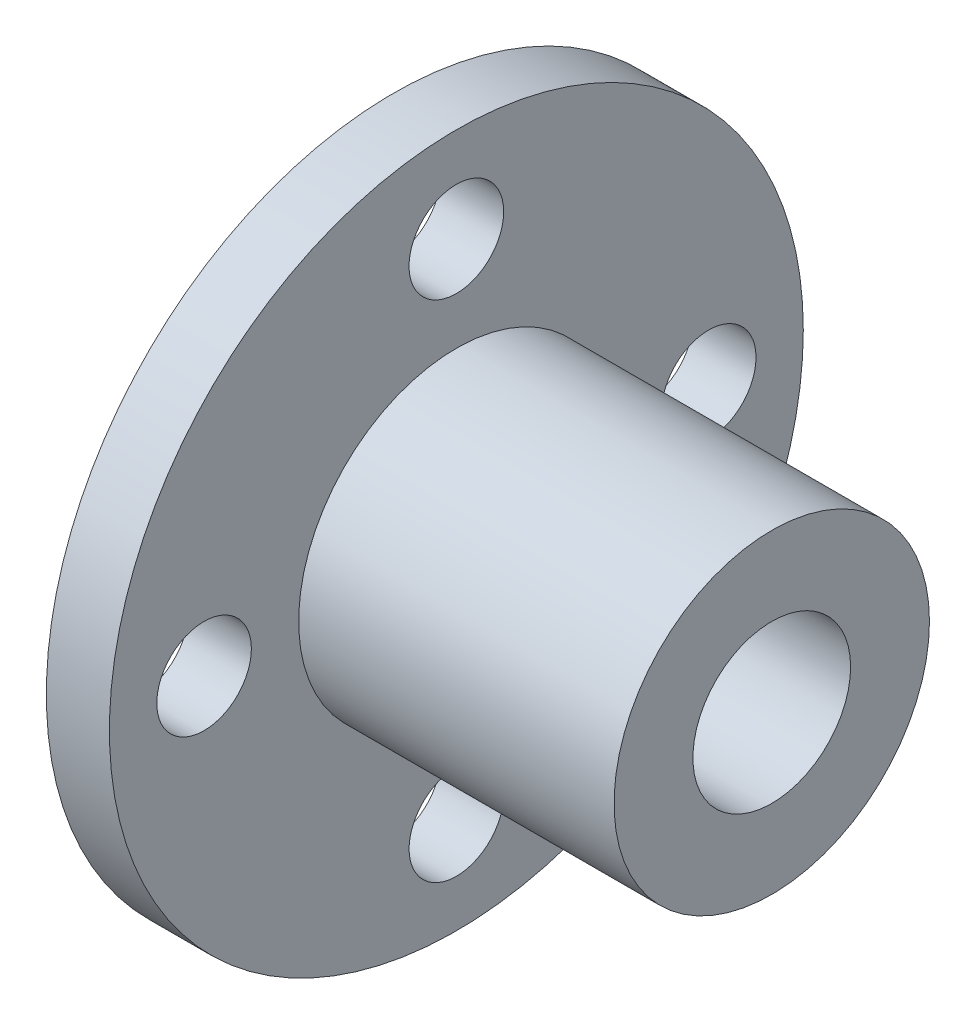
ISO-10303-21;
HEADER;
FILE_DESCRIPTION(('STEP AP214'),'2;1');
FILE_NAME('part.step','',(''),(''),'','','');
FILE_SCHEMA(('AUTOMOTIVE_DESIGN { 1 0 10303 214 1 1 1 1 }'));
ENDSEC;
DATA;
#1=APPLICATION_CONTEXT('core data for automotive mechanical design processes');
#2=APPLICATION_PROTOCOL_DEFINITION('international standard','automotive_design',2000,#1);
#3=PRODUCT_CONTEXT('',#1,'mechanical');
#4=PRODUCT('Part','Part','',(#3));
#5=PRODUCT_RELATED_PRODUCT_CATEGORY('part','',(#4));
#6=PRODUCT_DEFINITION_FORMATION('','',#4);
#7=PRODUCT_DEFINITION_CONTEXT('part definition',#1,'design');
#8=PRODUCT_DEFINITION('design','',#6,#7);
#9=PRODUCT_DEFINITION_SHAPE('','',#8);
#10=(LENGTH_UNIT() NAMED_UNIT(*) SI_UNIT(.MILLI.,.METRE.));
#11=(NAMED_UNIT(*) PLANE_ANGLE_UNIT() SI_UNIT($,.RADIAN.));
#12=(NAMED_UNIT(*) SI_UNIT($,.STERADIAN.) SOLID_ANGLE_UNIT());
#13=UNCERTAINTY_MEASURE_WITH_UNIT(LENGTH_MEASURE(1.E-05),#10,'distance_accuracy_value','');
#14=(GEOMETRIC_REPRESENTATION_CONTEXT(3) GLOBAL_UNCERTAINTY_ASSIGNED_CONTEXT((#13)) GLOBAL_UNIT_ASSIGNED_CONTEXT((#10,
#11,#12)) REPRESENTATION_CONTEXT('',''));
#15=CARTESIAN_POINT('',(0.,0.,0.));
#16=DIRECTION('',(0.,0.,1.));
#17=DIRECTION('',(1.,0.,0.));
#18=AXIS2_PLACEMENT_3D('',#15,#16,#17);
#19=CARTESIAN_POINT('',(2.,0.,0.));
#20=DIRECTION('',(-1.,0.,0.));
#21=DIRECTION('',(0.,0.,1.));
#22=AXIS2_PLACEMENT_3D('',#19,#20,#21);
#23=CYLINDRICAL_SURFACE('',#22,11.);
#24=CARTESIAN_POINT('',(2.,0.,0.));
#25=DIRECTION('',(1.,0.,0.));
#26=DIRECTION('',(0.,0.,-1.));
#27=AXIS2_PLACEMENT_3D('',#24,#25,#26);
#28=CIRCLE('',#27,11.);
#29=CARTESIAN_POINT('',(2.,0.,-11.));
#30=VERTEX_POINT('',#29);
#31=EDGE_CURVE('E10',#30,#30,#28,.T.);
#32=ORIENTED_EDGE('',*,*,#31,.F.);
#33=EDGE_LOOP('',(#32));
#34=FACE_BOUND('',#33,.T.);
#35=CARTESIAN_POINT('',(0.,0.,0.));
#36=DIRECTION('',(1.,0.,0.));
#37=DIRECTION('',(0.,0.,-1.));
#38=AXIS2_PLACEMENT_3D('',#35,#36,#37);
#39=CIRCLE('',#38,11.);
#40=CARTESIAN_POINT('',(0.,0.,-11.));
#41=VERTEX_POINT('',#40);
#42=EDGE_CURVE('E46',#41,#41,#39,.T.);
#43=ORIENTED_EDGE('',*,*,#42,.T.);
#44=EDGE_LOOP('',(#43));
#45=FACE_BOUND('',#44,.T.);
#46=ADVANCED_FACE('F39',(#34,#45),#23,.T.);
#47=CARTESIAN_POINT('',(2.,0.,0.));
#48=DIRECTION('',(1.,0.,0.));
#49=DIRECTION('',(0.,0.,-1.));
#50=AXIS2_PLACEMENT_3D('',#47,#48,#49);
#51=PLANE('',#50);
#52=CARTESIAN_POINT('',(2.,8.,0.));
#53=DIRECTION('',(1.,0.,0.));
#54=DIRECTION('',(0.,0.,-1.));
#55=AXIS2_PLACEMENT_3D('',#52,#53,#54);
#56=CIRCLE('',#55,1.5);
#57=CARTESIAN_POINT('',(2.,8.,-1.5));
#58=VERTEX_POINT('',#57);
#59=EDGE_CURVE('E61',#58,#58,#56,.T.);
#60=ORIENTED_EDGE('',*,*,#59,.F.);
#61=EDGE_LOOP('',(#60));
#62=FACE_BOUND('',#61,.T.);
#63=CARTESIAN_POINT('',(2.,0.000999999999972068,-8.001));
#64=DIRECTION('',(1.,0.,0.));
#65=DIRECTION('',(0.,0.,-1.));
#66=AXIS2_PLACEMENT_3D('',#63,#64,#65);
#67=CIRCLE('',#66,1.5);
#68=CARTESIAN_POINT('',(2.,0.000999999999972068,-9.501));
#69=VERTEX_POINT('',#68);
#70=EDGE_CURVE('E87',#69,#69,#67,.T.);
#71=ORIENTED_EDGE('',*,*,#70,.F.);
#72=EDGE_LOOP('',(#71));
#73=FACE_BOUND('',#72,.T.);
#74=CARTESIAN_POINT('',(2.,-8.,-0.00199999999994414));
#75=DIRECTION('',(1.,0.,0.));
#76=DIRECTION('',(0.,0.,-1.));
#77=AXIS2_PLACEMENT_3D('',#74,#75,#76);
#78=CIRCLE('',#77,1.5);
#79=CARTESIAN_POINT('',(2.,-8.,-1.50199999999994));
#80=VERTEX_POINT('',#79);
#81=EDGE_CURVE('E83',#80,#80,#78,.T.);
#82=ORIENTED_EDGE('',*,*,#81,.F.);
#83=EDGE_LOOP('',(#82));
#84=FACE_BOUND('',#83,.T.);
#85=CARTESIAN_POINT('',(2.,-0.000999999999916204,7.999));
#86=DIRECTION('',(1.,0.,0.));
#87=DIRECTION('',(0.,0.,-1.));
#88=AXIS2_PLACEMENT_3D('',#85,#86,#87);
#89=CIRCLE('',#88,1.5);
#90=CARTESIAN_POINT('',(2.,-0.000999999999916204,6.499));
#91=VERTEX_POINT('',#90);
#92=EDGE_CURVE('E80',#91,#91,#89,.T.);
#93=ORIENTED_EDGE('',*,*,#92,.F.);
#94=EDGE_LOOP('',(#93));
#95=FACE_BOUND('',#94,.T.);
#96=CARTESIAN_POINT('',(2.,0.,0.));
#97=DIRECTION('',(1.,0.,0.));
#98=DIRECTION('',(0.,0.,-1.));
#99=AXIS2_PLACEMENT_3D('',#96,#97,#98);
#100=CIRCLE('',#99,5.);
#101=CARTESIAN_POINT('',(2.,0.,-5.));
#102=VERTEX_POINT('',#101);
#103=EDGE_CURVE('E54',#102,#102,#100,.T.);
#104=ORIENTED_EDGE('',*,*,#103,.F.);
#105=EDGE_LOOP('',(#104));
#106=FACE_BOUND('',#105,.T.);
#107=ORIENTED_EDGE('',*,*,#31,.T.);
#108=EDGE_LOOP('',(#107));
#109=FACE_BOUND('',#108,.T.);
#110=ADVANCED_FACE('F108',(#62,#73,#84,#95,#106,#109),#51,.T.);
#111=CARTESIAN_POINT('',(0.,0.,0.));
#112=DIRECTION('',(1.,0.,0.));
#113=DIRECTION('',(0.,0.,-1.));
#114=AXIS2_PLACEMENT_3D('',#111,#112,#113);
#115=PLANE('',#114);
#116=CARTESIAN_POINT('',(0.,0.,0.));
#117=DIRECTION('',(1.,0.,0.));
#118=DIRECTION('',(0.,0.,-1.));
#119=AXIS2_PLACEMENT_3D('',#116,#117,#118);
#120=CIRCLE('',#119,2.5);
#121=CARTESIAN_POINT('',(0.,0.,-2.5));
#122=VERTEX_POINT('',#121);
#123=EDGE_CURVE('E84',#122,#122,#120,.T.);
#124=ORIENTED_EDGE('',*,*,#123,.T.);
#125=EDGE_LOOP('',(#124));
#126=FACE_BOUND('',#125,.T.);
#127=CARTESIAN_POINT('',(0.,8.,0.));
#128=DIRECTION('',(1.,0.,0.));
#129=DIRECTION('',(0.,0.,-1.));
#130=AXIS2_PLACEMENT_3D('',#127,#128,#129);
#131=CIRCLE('',#130,1.5);
#132=CARTESIAN_POINT('',(0.,8.,-1.5));
#133=VERTEX_POINT('',#132);
#134=EDGE_CURVE('E42',#133,#133,#131,.T.);
#135=ORIENTED_EDGE('',*,*,#134,.T.);
#136=EDGE_LOOP('',(#135));
#137=FACE_BOUND('',#136,.T.);
#138=CARTESIAN_POINT('',(0.,0.000999999999972068,-8.001));
#139=DIRECTION('',(1.,0.,0.));
#140=DIRECTION('',(0.,0.,-1.));
#141=AXIS2_PLACEMENT_3D('',#138,#139,#140);
#142=CIRCLE('',#141,1.5);
#143=CARTESIAN_POINT('',(0.,0.000999999999972068,-9.501));
#144=VERTEX_POINT('',#143);
#145=EDGE_CURVE('E63',#144,#144,#142,.T.);
#146=ORIENTED_EDGE('',*,*,#145,.T.);
#147=EDGE_LOOP('',(#146));
#148=FACE_BOUND('',#147,.T.);
#149=CARTESIAN_POINT('',(0.,-8.,-0.00199999999994414));
#150=DIRECTION('',(1.,0.,0.));
#151=DIRECTION('',(0.,0.,-1.));
#152=AXIS2_PLACEMENT_3D('',#149,#150,#151);
#153=CIRCLE('',#152,1.5);
#154=CARTESIAN_POINT('',(0.,-8.,-1.50199999999994));
#155=VERTEX_POINT('',#154);
#156=EDGE_CURVE('E60',#155,#155,#153,.T.);
#157=ORIENTED_EDGE('',*,*,#156,.T.);
#158=EDGE_LOOP('',(#157));
#159=FACE_BOUND('',#158,.T.);
#160=CARTESIAN_POINT('',(0.,-0.000999999999916204,7.999));
#161=DIRECTION('',(1.,0.,0.));
#162=DIRECTION('',(0.,0.,-1.));
#163=AXIS2_PLACEMENT_3D('',#160,#161,#162);
#164=CIRCLE('',#163,1.5);
#165=CARTESIAN_POINT('',(0.,-0.000999999999916204,6.499));
#166=VERTEX_POINT('',#165);
#167=EDGE_CURVE('E57',#166,#166,#164,.T.);
#168=ORIENTED_EDGE('',*,*,#167,.T.);
#169=EDGE_LOOP('',(#168));
#170=FACE_BOUND('',#169,.T.);
#171=ORIENTED_EDGE('',*,*,#42,.F.);
#172=EDGE_LOOP('',(#171));
#173=FACE_BOUND('',#172,.T.);
#174=ADVANCED_FACE('F95',(#126,#137,#148,#159,#170,#173),#115,.F.);
#175=CARTESIAN_POINT('',(12.,0.,0.));
#176=DIRECTION('',(-1.,0.,0.));
#177=DIRECTION('',(0.,0.,1.));
#178=AXIS2_PLACEMENT_3D('',#175,#176,#177);
#179=CYLINDRICAL_SURFACE('',#178,2.5);
#180=CARTESIAN_POINT('',(12.,0.,0.));
#181=DIRECTION('',(1.,0.,0.));
#182=DIRECTION('',(0.,0.,-1.));
#183=AXIS2_PLACEMENT_3D('',#180,#181,#182);
#184=CIRCLE('',#183,2.5);
#185=CARTESIAN_POINT('',(12.,0.,-2.5));
#186=VERTEX_POINT('',#185);
#187=EDGE_CURVE('E71',#186,#186,#184,.T.);
#188=ORIENTED_EDGE('',*,*,#187,.T.);
#189=EDGE_LOOP('',(#188));
#190=FACE_BOUND('',#189,.T.);
#191=ORIENTED_EDGE('',*,*,#123,.F.);
#192=EDGE_LOOP('',(#191));
#193=FACE_BOUND('',#192,.T.);
#194=ADVANCED_FACE('F97',(#190,#193),#179,.F.);
#195=CARTESIAN_POINT('',(12.,0.,0.));
#196=DIRECTION('',(-1.,0.,0.));
#197=DIRECTION('',(0.,0.,1.));
#198=AXIS2_PLACEMENT_3D('',#195,#196,#197);
#199=CYLINDRICAL_SURFACE('',#198,5.);
#200=CARTESIAN_POINT('',(12.,0.,0.));
#201=DIRECTION('',(1.,0.,0.));
#202=DIRECTION('',(0.,0.,-1.));
#203=AXIS2_PLACEMENT_3D('',#200,#201,#202);
#204=CIRCLE('',#203,5.);
#205=CARTESIAN_POINT('',(12.,0.,-5.));
#206=VERTEX_POINT('',#205);
#207=EDGE_CURVE('E51',#206,#206,#204,.T.);
#208=ORIENTED_EDGE('',*,*,#207,.F.);
#209=EDGE_LOOP('',(#208));
#210=FACE_BOUND('',#209,.T.);
#211=ORIENTED_EDGE('',*,*,#103,.T.);
#212=EDGE_LOOP('',(#211));
#213=FACE_BOUND('',#212,.T.);
#214=ADVANCED_FACE('F99',(#210,#213),#199,.T.);
#215=CARTESIAN_POINT('',(12.,0.,0.));
#216=DIRECTION('',(1.,0.,0.));
#217=DIRECTION('',(0.,0.,-1.));
#218=AXIS2_PLACEMENT_3D('',#215,#216,#217);
#219=PLANE('',#218);
#220=ORIENTED_EDGE('',*,*,#187,.F.);
#221=EDGE_LOOP('',(#220));
#222=FACE_BOUND('',#221,.T.);
#223=ORIENTED_EDGE('',*,*,#207,.T.);
#224=EDGE_LOOP('',(#223));
#225=FACE_BOUND('',#224,.T.);
#226=ADVANCED_FACE('F105',(#222,#225),#219,.T.);
#227=CARTESIAN_POINT('',(-8.,-0.000999999999916204,7.999));
#228=DIRECTION('',(1.,0.,0.));
#229=DIRECTION('',(0.,0.,-1.));
#230=AXIS2_PLACEMENT_3D('',#227,#228,#229);
#231=CYLINDRICAL_SURFACE('',#230,1.5);
#232=ORIENTED_EDGE('',*,*,#92,.T.);
#233=EDGE_LOOP('',(#232));
#234=FACE_BOUND('',#233,.T.);
#235=ORIENTED_EDGE('',*,*,#167,.F.);
#236=EDGE_LOOP('',(#235));
#237=FACE_BOUND('',#236,.T.);
#238=ADVANCED_FACE('F130',(#234,#237),#231,.F.);
#239=CARTESIAN_POINT('',(-8.,-8.,-0.00199999999994414));
#240=DIRECTION('',(1.,0.,0.));
#241=DIRECTION('',(0.,0.,-1.));
#242=AXIS2_PLACEMENT_3D('',#239,#240,#241);
#243=CYLINDRICAL_SURFACE('',#242,1.5);
#244=ORIENTED_EDGE('',*,*,#81,.T.);
#245=EDGE_LOOP('',(#244));
#246=FACE_BOUND('',#245,.T.);
#247=ORIENTED_EDGE('',*,*,#156,.F.);
#248=EDGE_LOOP('',(#247));
#249=FACE_BOUND('',#248,.T.);
#250=ADVANCED_FACE('F133',(#246,#249),#243,.F.);
#251=CARTESIAN_POINT('',(-8.,0.000999999999972068,-8.001));
#252=DIRECTION('',(1.,0.,0.));
#253=DIRECTION('',(0.,0.,-1.));
#254=AXIS2_PLACEMENT_3D('',#251,#252,#253);
#255=CYLINDRICAL_SURFACE('',#254,1.5);
#256=ORIENTED_EDGE('',*,*,#70,.T.);
#257=EDGE_LOOP('',(#256));
#258=FACE_BOUND('',#257,.T.);
#259=ORIENTED_EDGE('',*,*,#145,.F.);
#260=EDGE_LOOP('',(#259));
#261=FACE_BOUND('',#260,.T.);
#262=ADVANCED_FACE('F141',(#258,#261),#255,.F.);
#263=CARTESIAN_POINT('',(-8.,8.,0.));
#264=DIRECTION('',(1.,0.,0.));
#265=DIRECTION('',(0.,0.,-1.));
#266=AXIS2_PLACEMENT_3D('',#263,#264,#265);
#267=CYLINDRICAL_SURFACE('',#266,1.5);
#268=ORIENTED_EDGE('',*,*,#59,.T.);
#269=EDGE_LOOP('',(#268));
#270=FACE_BOUND('',#269,.T.);
#271=ORIENTED_EDGE('',*,*,#134,.F.);
#272=EDGE_LOOP('',(#271));
#273=FACE_BOUND('',#272,.T.);
#274=ADVANCED_FACE('F149',(#270,#273),#267,.F.);
#275=CLOSED_SHELL('',(#46,#110,#174,#194,#214,#226,#238,#250,#262,#274));
#276=MANIFOLD_SOLID_BREP('B2',#275);
#277=ADVANCED_BREP_SHAPE_REPRESENTATION('',(#18,#276),#14);
#278=SHAPE_DEFINITION_REPRESENTATION(#9,#277);
ENDSEC;
END-ISO-10303-21;
